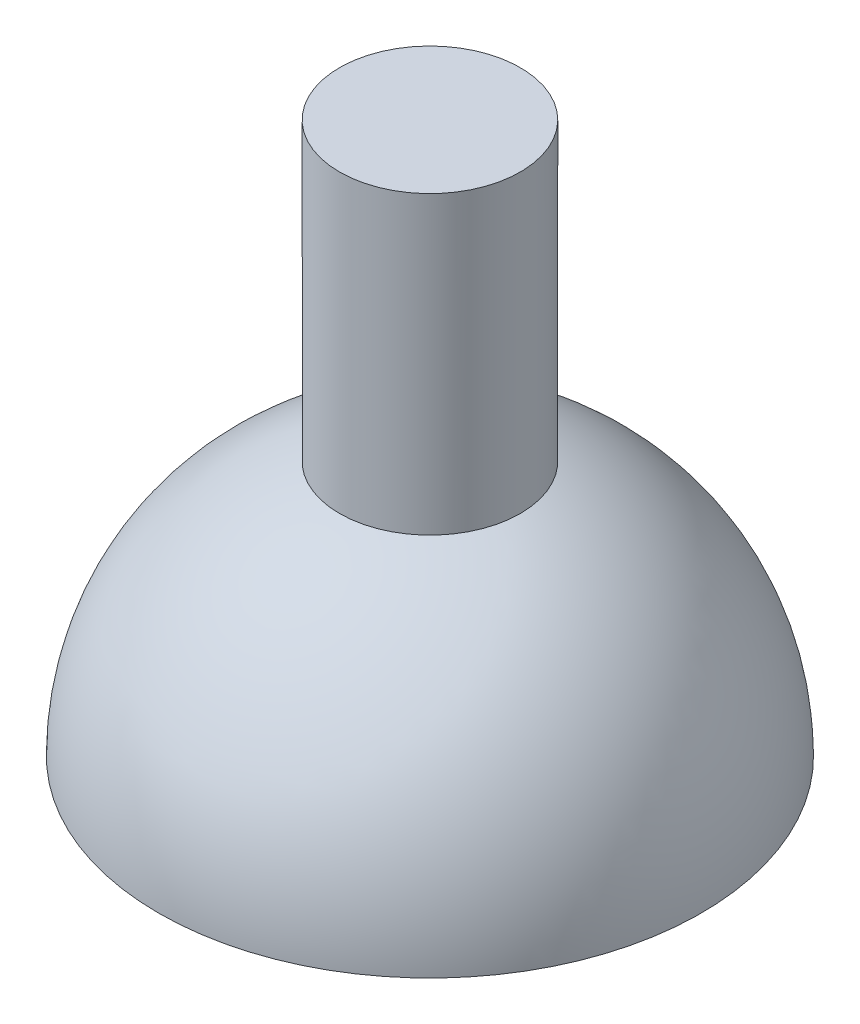
ISO-10303-21;
HEADER;
FILE_DESCRIPTION(('STEP AP214'),'2;1');
FILE_NAME('part.step','',(''),(''),'','','');
FILE_SCHEMA(('AUTOMOTIVE_DESIGN { 1 0 10303 214 1 1 1 1 }'));
ENDSEC;
DATA;
#1=APPLICATION_CONTEXT('core data for automotive mechanical design processes');
#2=APPLICATION_PROTOCOL_DEFINITION('international standard','automotive_design',2000,#1);
#3=PRODUCT_CONTEXT('',#1,'mechanical');
#4=PRODUCT('Part','Part','',(#3));
#5=PRODUCT_RELATED_PRODUCT_CATEGORY('part','',(#4));
#6=PRODUCT_DEFINITION_FORMATION('','',#4);
#7=PRODUCT_DEFINITION_CONTEXT('part definition',#1,'design');
#8=PRODUCT_DEFINITION('design','',#6,#7);
#9=PRODUCT_DEFINITION_SHAPE('','',#8);
#10=(LENGTH_UNIT() NAMED_UNIT(*) SI_UNIT(.MILLI.,.METRE.));
#11=(NAMED_UNIT(*) PLANE_ANGLE_UNIT() SI_UNIT($,.RADIAN.));
#12=(NAMED_UNIT(*) SI_UNIT($,.STERADIAN.) SOLID_ANGLE_UNIT());
#13=UNCERTAINTY_MEASURE_WITH_UNIT(LENGTH_MEASURE(1.E-05),#10,'distance_accuracy_value','');
#14=(GEOMETRIC_REPRESENTATION_CONTEXT(3) GLOBAL_UNCERTAINTY_ASSIGNED_CONTEXT((#13)) GLOBAL_UNIT_ASSIGNED_CONTEXT((#10,
#11,#12)) REPRESENTATION_CONTEXT('',''));
#15=CARTESIAN_POINT('',(0.,0.,0.));
#16=DIRECTION('',(0.,0.,1.));
#17=DIRECTION('',(1.,0.,0.));
#18=AXIS2_PLACEMENT_3D('',#15,#16,#17);
#19=CARTESIAN_POINT('',(0.,0.,0.));
#20=DIRECTION('',(0.,0.,1.));
#21=DIRECTION('',(-1.,0.,0.));
#22=AXIS2_PLACEMENT_3D('',#19,#20,#21);
#23=SPHERICAL_SURFACE('',#22,30.);
#24=CARTESIAN_POINT('',(0.,0.,0.));
#25=DIRECTION('',(0.,1.,0.));
#26=DIRECTION('',(0.,0.,1.));
#27=AXIS2_PLACEMENT_3D('',#24,#25,#26);
#28=SPHERICAL_SURFACE('',#27,30.);
#29=CARTESIAN_POINT('',(0.,0.,0.));
#30=DIRECTION('',(0.,1.,0.));
#31=DIRECTION('',(0.,0.,1.));
#32=AXIS2_PLACEMENT_3D('',#29,#30,#31);
#33=CIRCLE('',#32,30.);
#34=CARTESIAN_POINT('',(0.,0.,30.));
#35=VERTEX_POINT('',#34);
#36=EDGE_CURVE('E49',#35,#35,#33,.T.);
#37=ORIENTED_EDGE('',*,*,#36,.T.);
#38=EDGE_LOOP('',(#37));
#39=FACE_BOUND('',#38,.T.);
#40=CARTESIAN_POINT('',(0.,28.2842712474619,0.));
#41=DIRECTION('',(0.,-1.,0.));
#42=DIRECTION('',(0.,0.,-1.));
#43=AXIS2_PLACEMENT_3D('',#40,#41,#42);
#44=CIRCLE('',#43,10.);
#45=CARTESIAN_POINT('',(0.,28.2842712474619,-10.));
#46=VERTEX_POINT('',#45);
#47=EDGE_CURVE('E10',#46,#46,#44,.F.);
#48=ORIENTED_EDGE('',*,*,#47,.F.);
#49=EDGE_LOOP('',(#48));
#50=FACE_BOUND('',#49,.T.);
#51=ADVANCED_FACE('F37',(#39,#50),#28,.T.);
#52=CARTESIAN_POINT('',(0.,26.,0.));
#53=DIRECTION('',(0.,1.,0.));
#54=DIRECTION('',(0.,0.,1.));
#55=AXIS2_PLACEMENT_3D('',#52,#53,#54);
#56=CYLINDRICAL_SURFACE('',#55,10.);
#57=ORIENTED_EDGE('',*,*,#47,.T.);
#58=EDGE_LOOP('',(#57));
#59=FACE_BOUND('',#58,.T.);
#60=CARTESIAN_POINT('',(0.,61.,0.));
#61=DIRECTION('',(0.,1.,0.));
#62=DIRECTION('',(0.,0.,1.));
#63=AXIS2_PLACEMENT_3D('',#60,#61,#62);
#64=CIRCLE('',#63,10.);
#65=CARTESIAN_POINT('',(0.,61.,10.));
#66=VERTEX_POINT('',#65);
#67=EDGE_CURVE('E44',#66,#66,#64,.T.);
#68=ORIENTED_EDGE('',*,*,#67,.F.);
#69=EDGE_LOOP('',(#68));
#70=FACE_BOUND('',#69,.T.);
#71=ADVANCED_FACE('F84',(#59,#70),#56,.T.);
#72=CARTESIAN_POINT('',(0.,61.,0.));
#73=DIRECTION('',(0.,1.,0.));
#74=DIRECTION('',(0.,0.,1.));
#75=AXIS2_PLACEMENT_3D('',#72,#73,#74);
#76=PLANE('',#75);
#77=ORIENTED_EDGE('',*,*,#67,.T.);
#78=EDGE_LOOP('',(#77));
#79=FACE_BOUND('',#78,.T.);
#80=ADVANCED_FACE('F89',(#79),#76,.T.);
#81=CARTESIAN_POINT('',(0.,0.,0.));
#82=DIRECTION('',(0.,1.,0.));
#83=DIRECTION('',(0.,0.,1.));
#84=AXIS2_PLACEMENT_3D('',#81,#82,#83);
#85=PLANE('',#84);
#86=CARTESIAN_POINT('',(0.,0.,0.));
#87=DIRECTION('',(0.,1.,0.));
#88=DIRECTION('',(0.,0.,1.));
#89=AXIS2_PLACEMENT_3D('',#86,#87,#88);
#90=CIRCLE('',#89,29.);
#91=CARTESIAN_POINT('',(0.,0.,29.));
#92=VERTEX_POINT('',#91);
#93=EDGE_CURVE('E57',#92,#92,#90,.T.);
#94=ORIENTED_EDGE('',*,*,#93,.T.);
#95=EDGE_LOOP('',(#94));
#96=FACE_BOUND('',#95,.T.);
#97=ORIENTED_EDGE('',*,*,#36,.F.);
#98=EDGE_LOOP('',(#97));
#99=FACE_BOUND('',#98,.T.);
#100=ADVANCED_FACE('F93',(#96,#99),#85,.F.);
#101=CARTESIAN_POINT('',(0.,0.,0.));
#102=DIRECTION('',(0.,0.,1.));
#103=DIRECTION('',(-1.,0.,0.));
#104=AXIS2_PLACEMENT_3D('',#101,#102,#103);
#105=SPHERICAL_SURFACE('',#104,29.);
#106=CARTESIAN_POINT('',(0.,0.,0.));
#107=DIRECTION('',(0.,1.,0.));
#108=DIRECTION('',(0.,0.,1.));
#109=AXIS2_PLACEMENT_3D('',#106,#107,#108);
#110=SPHERICAL_SURFACE('',#109,29.);
#111=ORIENTED_EDGE('',*,*,#93,.F.);
#112=EDGE_LOOP('',(#111));
#113=FACE_BOUND('',#112,.T.);
#114=CARTESIAN_POINT('',(0.,27.5680975041804,0.));
#115=DIRECTION('',(0.,-1.,0.));
#116=DIRECTION('',(0.,0.,-1.));
#117=AXIS2_PLACEMENT_3D('',#114,#115,#116);
#118=CIRCLE('',#117,9.);
#119=CARTESIAN_POINT('',(0.,27.5680975041804,-9.));
#120=VERTEX_POINT('',#119);
#121=EDGE_CURVE('E54',#120,#120,#118,.F.);
#122=ORIENTED_EDGE('',*,*,#121,.T.);
#123=EDGE_LOOP('',(#122));
#124=FACE_BOUND('',#123,.T.);
#125=ADVANCED_FACE('F69',(#113,#124),#110,.F.);
#126=CARTESIAN_POINT('',(0.,26.,0.));
#127=DIRECTION('',(0.,1.,0.));
#128=DIRECTION('',(0.,0.,1.));
#129=AXIS2_PLACEMENT_3D('',#126,#127,#128);
#130=CYLINDRICAL_SURFACE('',#129,9.);
#131=ORIENTED_EDGE('',*,*,#121,.F.);
#132=EDGE_LOOP('',(#131));
#133=FACE_BOUND('',#132,.T.);
#134=CARTESIAN_POINT('',(0.,60.,0.));
#135=DIRECTION('',(0.,1.,0.));
#136=DIRECTION('',(0.,0.,1.));
#137=AXIS2_PLACEMENT_3D('',#134,#135,#136);
#138=CIRCLE('',#137,9.);
#139=CARTESIAN_POINT('',(0.,60.,9.));
#140=VERTEX_POINT('',#139);
#141=EDGE_CURVE('E61',#140,#140,#138,.T.);
#142=ORIENTED_EDGE('',*,*,#141,.T.);
#143=EDGE_LOOP('',(#142));
#144=FACE_BOUND('',#143,.T.);
#145=ADVANCED_FACE('F71',(#133,#144),#130,.F.);
#146=CARTESIAN_POINT('',(0.,60.,0.));
#147=DIRECTION('',(0.,1.,0.));
#148=DIRECTION('',(0.,0.,1.));
#149=AXIS2_PLACEMENT_3D('',#146,#147,#148);
#150=PLANE('',#149);
#151=ORIENTED_EDGE('',*,*,#141,.F.);
#152=EDGE_LOOP('',(#151));
#153=FACE_BOUND('',#152,.T.);
#154=ADVANCED_FACE('F74',(#153),#150,.F.);
#155=CLOSED_SHELL('',(#51,#71,#80,#100,#125,#145,#154));
#156=MANIFOLD_SOLID_BREP('B2',#155);
#157=ADVANCED_BREP_SHAPE_REPRESENTATION('',(#18,#156),#14);
#158=SHAPE_DEFINITION_REPRESENTATION(#9,#157);
ENDSEC;
END-ISO-10303-21;
